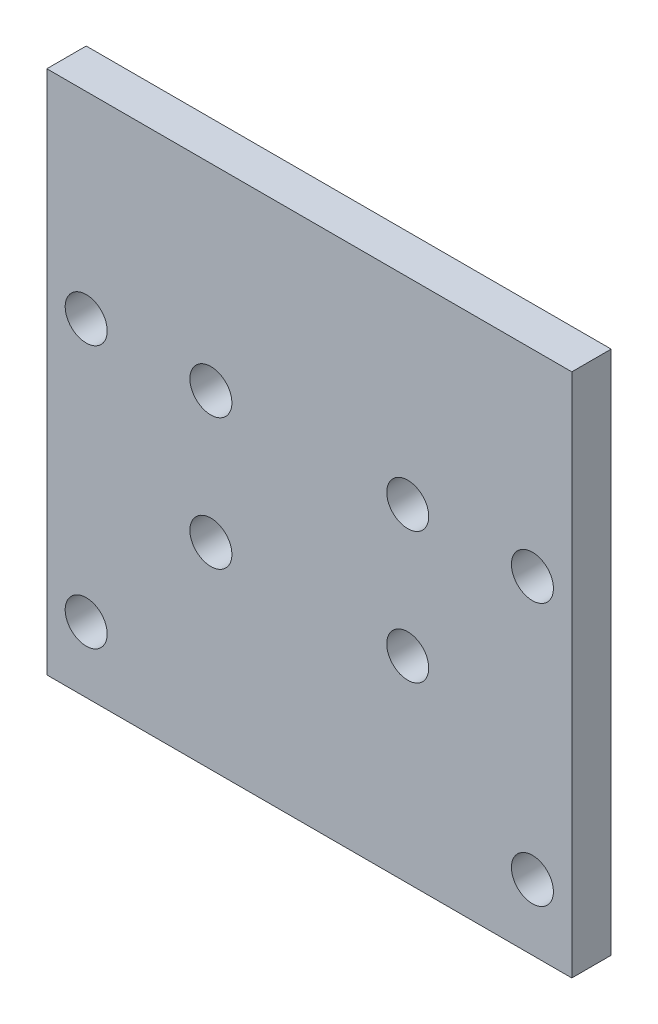
ISO-10303-21;
HEADER;
FILE_DESCRIPTION(('STEP AP214'),'2;1');
FILE_NAME('part.step','',(''),(''),'','','');
FILE_SCHEMA(('AUTOMOTIVE_DESIGN { 1 0 10303 214 1 1 1 1 }'));
ENDSEC;
DATA;
#1=APPLICATION_CONTEXT('core data for automotive mechanical design processes');
#2=APPLICATION_PROTOCOL_DEFINITION('international standard','automotive_design',2000,#1);
#3=PRODUCT_CONTEXT('',#1,'mechanical');
#4=PRODUCT('Part','Part','',(#3));
#5=PRODUCT_RELATED_PRODUCT_CATEGORY('part','',(#4));
#6=PRODUCT_DEFINITION_FORMATION('','',#4);
#7=PRODUCT_DEFINITION_CONTEXT('part definition',#1,'design');
#8=PRODUCT_DEFINITION('design','',#6,#7);
#9=PRODUCT_DEFINITION_SHAPE('','',#8);
#10=(LENGTH_UNIT() NAMED_UNIT(*) SI_UNIT(.MILLI.,.METRE.));
#11=(NAMED_UNIT(*) PLANE_ANGLE_UNIT() SI_UNIT($,.RADIAN.));
#12=(NAMED_UNIT(*) SI_UNIT($,.STERADIAN.) SOLID_ANGLE_UNIT());
#13=UNCERTAINTY_MEASURE_WITH_UNIT(LENGTH_MEASURE(1.E-05),#10,'distance_accuracy_value','');
#14=(GEOMETRIC_REPRESENTATION_CONTEXT(3) GLOBAL_UNCERTAINTY_ASSIGNED_CONTEXT((#13)) GLOBAL_UNIT_ASSIGNED_CONTEXT((#10,
#11,#12)) REPRESENTATION_CONTEXT('',''));
#15=CARTESIAN_POINT('',(0.,0.,0.));
#16=DIRECTION('',(0.,0.,1.));
#17=DIRECTION('',(1.,0.,0.));
#18=AXIS2_PLACEMENT_3D('',#15,#16,#17);
#19=CARTESIAN_POINT('',(20.,-20.,3.));
#20=DIRECTION('',(-1.,0.,0.));
#21=DIRECTION('',(0.,0.,1.));
#22=AXIS2_PLACEMENT_3D('',#19,#20,#21);
#23=PLANE('',#22);
#24=DIRECTION('',(0.,1.,0.));
#25=VECTOR('',#24,1.);
#26=CARTESIAN_POINT('',(20.,-20.,0.));
#27=LINE('',#26,#25);
#28=CARTESIAN_POINT('',(20.,-20.,0.));
#29=VERTEX_POINT('',#28);
#30=CARTESIAN_POINT('',(20.,20.,0.));
#31=VERTEX_POINT('',#30);
#32=EDGE_CURVE('E102',#29,#31,#27,.T.);
#33=ORIENTED_EDGE('',*,*,#32,.T.);
#34=DIRECTION('',(0.,0.,-1.));
#35=VECTOR('',#34,1.);
#36=CARTESIAN_POINT('',(20.,20.,3.));
#37=LINE('',#36,#35);
#38=CARTESIAN_POINT('',(20.,20.,3.));
#39=VERTEX_POINT('',#38);
#40=EDGE_CURVE('E11',#39,#31,#37,.T.);
#41=ORIENTED_EDGE('',*,*,#40,.F.);
#42=DIRECTION('',(0.,1.,0.));
#43=VECTOR('',#42,1.);
#44=CARTESIAN_POINT('',(20.,-20.,3.));
#45=LINE('',#44,#43);
#46=CARTESIAN_POINT('',(20.,-20.,3.));
#47=VERTEX_POINT('',#46);
#48=EDGE_CURVE('E90',#47,#39,#45,.T.);
#49=ORIENTED_EDGE('',*,*,#48,.F.);
#50=DIRECTION('',(0.,0.,-1.));
#51=VECTOR('',#50,1.);
#52=CARTESIAN_POINT('',(20.,-20.,3.));
#53=LINE('',#52,#51);
#54=EDGE_CURVE('E98',#47,#29,#53,.T.);
#55=ORIENTED_EDGE('',*,*,#54,.T.);
#56=EDGE_LOOP('',(#33,#41,#49,#55));
#57=FACE_BOUND('',#56,.T.);
#58=ADVANCED_FACE('F39',(#57),#23,.F.);
#59=CARTESIAN_POINT('',(-20.,20.,3.));
#60=DIRECTION('',(0.,-1.,0.));
#61=DIRECTION('',(0.,0.,-1.));
#62=AXIS2_PLACEMENT_3D('',#59,#60,#61);
#63=PLANE('',#62);
#64=DIRECTION('',(-1.,0.,0.));
#65=VECTOR('',#64,1.);
#66=CARTESIAN_POINT('',(-20.,20.,0.));
#67=LINE('',#66,#65);
#68=CARTESIAN_POINT('',(-20.,20.,0.));
#69=VERTEX_POINT('',#68);
#70=EDGE_CURVE('E94',#31,#69,#67,.T.);
#71=ORIENTED_EDGE('',*,*,#70,.T.);
#72=DIRECTION('',(0.,0.,-1.));
#73=VECTOR('',#72,1.);
#74=CARTESIAN_POINT('',(-20.,20.,3.));
#75=LINE('',#74,#73);
#76=CARTESIAN_POINT('',(-20.,20.,3.));
#77=VERTEX_POINT('',#76);
#78=EDGE_CURVE('E47',#77,#69,#75,.T.);
#79=ORIENTED_EDGE('',*,*,#78,.F.);
#80=DIRECTION('',(-1.,0.,0.));
#81=VECTOR('',#80,1.);
#82=CARTESIAN_POINT('',(-20.,20.,3.));
#83=LINE('',#82,#81);
#84=EDGE_CURVE('E85',#39,#77,#83,.T.);
#85=ORIENTED_EDGE('',*,*,#84,.F.);
#86=ORIENTED_EDGE('',*,*,#40,.T.);
#87=EDGE_LOOP('',(#71,#79,#85,#86));
#88=FACE_BOUND('',#87,.T.);
#89=ADVANCED_FACE('F93',(#88),#63,.F.);
#90=CARTESIAN_POINT('',(-20.,-20.,3.));
#91=DIRECTION('',(1.,0.,0.));
#92=DIRECTION('',(0.,0.,-1.));
#93=AXIS2_PLACEMENT_3D('',#90,#91,#92);
#94=PLANE('',#93);
#95=DIRECTION('',(0.,-1.,0.));
#96=VECTOR('',#95,1.);
#97=CARTESIAN_POINT('',(-20.,-20.,0.));
#98=LINE('',#97,#96);
#99=CARTESIAN_POINT('',(-20.,-20.,0.));
#100=VERTEX_POINT('',#99);
#101=EDGE_CURVE('E72',#69,#100,#98,.T.);
#102=ORIENTED_EDGE('',*,*,#101,.T.);
#103=DIRECTION('',(0.,0.,-1.));
#104=VECTOR('',#103,1.);
#105=CARTESIAN_POINT('',(-20.,-20.,3.));
#106=LINE('',#105,#104);
#107=CARTESIAN_POINT('',(-20.,-20.,3.));
#108=VERTEX_POINT('',#107);
#109=EDGE_CURVE('E95',#108,#100,#106,.T.);
#110=ORIENTED_EDGE('',*,*,#109,.F.);
#111=DIRECTION('',(0.,-1.,0.));
#112=VECTOR('',#111,1.);
#113=CARTESIAN_POINT('',(-20.,-20.,3.));
#114=LINE('',#113,#112);
#115=EDGE_CURVE('E88',#77,#108,#114,.T.);
#116=ORIENTED_EDGE('',*,*,#115,.F.);
#117=ORIENTED_EDGE('',*,*,#78,.T.);
#118=EDGE_LOOP('',(#102,#110,#116,#117));
#119=FACE_BOUND('',#118,.T.);
#120=ADVANCED_FACE('F96',(#119),#94,.F.);
#121=CARTESIAN_POINT('',(-20.,-20.,3.));
#122=DIRECTION('',(0.,1.,0.));
#123=DIRECTION('',(0.,0.,1.));
#124=AXIS2_PLACEMENT_3D('',#121,#122,#123);
#125=PLANE('',#124);
#126=DIRECTION('',(1.,0.,0.));
#127=VECTOR('',#126,1.);
#128=CARTESIAN_POINT('',(-20.,-20.,0.));
#129=LINE('',#128,#127);
#130=EDGE_CURVE('E78',#100,#29,#129,.T.);
#131=ORIENTED_EDGE('',*,*,#130,.T.);
#132=ORIENTED_EDGE('',*,*,#54,.F.);
#133=DIRECTION('',(1.,0.,0.));
#134=VECTOR('',#133,1.);
#135=CARTESIAN_POINT('',(-20.,-20.,3.));
#136=LINE('',#135,#134);
#137=EDGE_CURVE('E55',#108,#47,#136,.T.);
#138=ORIENTED_EDGE('',*,*,#137,.F.);
#139=ORIENTED_EDGE('',*,*,#109,.T.);
#140=EDGE_LOOP('',(#131,#132,#138,#139));
#141=FACE_BOUND('',#140,.T.);
#142=ADVANCED_FACE('F110',(#141),#125,.F.);
#143=CARTESIAN_POINT('',(0.,0.,3.));
#144=DIRECTION('',(0.,0.,-1.));
#145=DIRECTION('',(-1.,0.,0.));
#146=AXIS2_PLACEMENT_3D('',#143,#144,#145);
#147=PLANE('',#146);
#148=CARTESIAN_POINT('',(7.5,5.,3.));
#149=DIRECTION('',(0.,0.,1.));
#150=DIRECTION('',(1.,0.,0.));
#151=AXIS2_PLACEMENT_3D('',#148,#149,#150);
#152=CIRCLE('',#151,1.6);
#153=CARTESIAN_POINT('',(9.1,5.,3.));
#154=VERTEX_POINT('',#153);
#155=EDGE_CURVE('E141',#154,#154,#152,.T.);
#156=ORIENTED_EDGE('',*,*,#155,.F.);
#157=EDGE_LOOP('',(#156));
#158=FACE_BOUND('',#157,.T.);
#159=CARTESIAN_POINT('',(7.5,-5.,3.));
#160=DIRECTION('',(0.,0.,1.));
#161=DIRECTION('',(1.,0.,0.));
#162=AXIS2_PLACEMENT_3D('',#159,#160,#161);
#163=CIRCLE('',#162,1.6);
#164=CARTESIAN_POINT('',(9.1,-5.,3.));
#165=VERTEX_POINT('',#164);
#166=EDGE_CURVE('E135',#165,#165,#163,.T.);
#167=ORIENTED_EDGE('',*,*,#166,.F.);
#168=EDGE_LOOP('',(#167));
#169=FACE_BOUND('',#168,.T.);
#170=CARTESIAN_POINT('',(-7.5,-5.,3.));
#171=DIRECTION('',(0.,0.,1.));
#172=DIRECTION('',(1.,0.,0.));
#173=AXIS2_PLACEMENT_3D('',#170,#171,#172);
#174=CIRCLE('',#173,1.6);
#175=CARTESIAN_POINT('',(-5.9,-5.,3.));
#176=VERTEX_POINT('',#175);
#177=EDGE_CURVE('E129',#176,#176,#174,.T.);
#178=ORIENTED_EDGE('',*,*,#177,.F.);
#179=EDGE_LOOP('',(#178));
#180=FACE_BOUND('',#179,.T.);
#181=CARTESIAN_POINT('',(-17.,-15.,3.));
#182=DIRECTION('',(0.,0.,1.));
#183=DIRECTION('',(1.,0.,0.));
#184=AXIS2_PLACEMENT_3D('',#181,#182,#183);
#185=CIRCLE('',#184,1.6);
#186=CARTESIAN_POINT('',(-15.4,-15.,3.));
#187=VERTEX_POINT('',#186);
#188=EDGE_CURVE('E122',#187,#187,#185,.T.);
#189=ORIENTED_EDGE('',*,*,#188,.F.);
#190=EDGE_LOOP('',(#189));
#191=FACE_BOUND('',#190,.T.);
#192=CARTESIAN_POINT('',(-17.,5.,3.));
#193=DIRECTION('',(0.,0.,1.));
#194=DIRECTION('',(1.,0.,0.));
#195=AXIS2_PLACEMENT_3D('',#192,#193,#194);
#196=CIRCLE('',#195,1.6);
#197=CARTESIAN_POINT('',(-15.4,5.,3.));
#198=VERTEX_POINT('',#197);
#199=EDGE_CURVE('E158',#198,#198,#196,.T.);
#200=ORIENTED_EDGE('',*,*,#199,.F.);
#201=EDGE_LOOP('',(#200));
#202=FACE_BOUND('',#201,.T.);
#203=CARTESIAN_POINT('',(17.,5.,3.));
#204=DIRECTION('',(0.,0.,1.));
#205=DIRECTION('',(-1.,0.,0.));
#206=AXIS2_PLACEMENT_3D('',#203,#204,#205);
#207=CIRCLE('',#206,1.6);
#208=CARTESIAN_POINT('',(15.4,5.,3.));
#209=VERTEX_POINT('',#208);
#210=EDGE_CURVE('E152',#209,#209,#207,.T.);
#211=ORIENTED_EDGE('',*,*,#210,.F.);
#212=EDGE_LOOP('',(#211));
#213=FACE_BOUND('',#212,.T.);
#214=CARTESIAN_POINT('',(17.,-15.,3.));
#215=DIRECTION('',(0.,0.,1.));
#216=DIRECTION('',(-1.,0.,0.));
#217=AXIS2_PLACEMENT_3D('',#214,#215,#216);
#218=CIRCLE('',#217,1.6);
#219=CARTESIAN_POINT('',(15.4,-15.,3.));
#220=VERTEX_POINT('',#219);
#221=EDGE_CURVE('E146',#220,#220,#218,.T.);
#222=ORIENTED_EDGE('',*,*,#221,.F.);
#223=EDGE_LOOP('',(#222));
#224=FACE_BOUND('',#223,.T.);
#225=CARTESIAN_POINT('',(-7.5,5.,3.));
#226=DIRECTION('',(0.,0.,1.));
#227=DIRECTION('',(1.,0.,0.));
#228=AXIS2_PLACEMENT_3D('',#225,#226,#227);
#229=CIRCLE('',#228,1.6);
#230=CARTESIAN_POINT('',(-5.9,5.,3.));
#231=VERTEX_POINT('',#230);
#232=EDGE_CURVE('E116',#231,#231,#229,.T.);
#233=ORIENTED_EDGE('',*,*,#232,.F.);
#234=EDGE_LOOP('',(#233));
#235=FACE_BOUND('',#234,.T.);
#236=ORIENTED_EDGE('',*,*,#48,.T.);
#237=ORIENTED_EDGE('',*,*,#84,.T.);
#238=ORIENTED_EDGE('',*,*,#115,.T.);
#239=ORIENTED_EDGE('',*,*,#137,.T.);
#240=EDGE_LOOP('',(#236,#237,#238,#239));
#241=FACE_BOUND('',#240,.T.);
#242=ADVANCED_FACE('F86',(#158,#169,#180,#191,#202,#213,#224,#235,#241),#147,.F.);
#243=CARTESIAN_POINT('',(0.,0.,0.));
#244=DIRECTION('',(0.,0.,-1.));
#245=DIRECTION('',(-1.,0.,0.));
#246=AXIS2_PLACEMENT_3D('',#243,#244,#245);
#247=PLANE('',#246);
#248=CARTESIAN_POINT('',(7.5,5.,0.));
#249=DIRECTION('',(0.,0.,1.));
#250=DIRECTION('',(1.,0.,0.));
#251=AXIS2_PLACEMENT_3D('',#248,#249,#250);
#252=CIRCLE('',#251,1.6);
#253=CARTESIAN_POINT('',(9.1,5.,0.));
#254=VERTEX_POINT('',#253);
#255=EDGE_CURVE('E119',#254,#254,#252,.T.);
#256=ORIENTED_EDGE('',*,*,#255,.T.);
#257=EDGE_LOOP('',(#256));
#258=FACE_BOUND('',#257,.T.);
#259=CARTESIAN_POINT('',(7.5,-5.,0.));
#260=DIRECTION('',(0.,0.,1.));
#261=DIRECTION('',(1.,0.,0.));
#262=AXIS2_PLACEMENT_3D('',#259,#260,#261);
#263=CIRCLE('',#262,1.6);
#264=CARTESIAN_POINT('',(9.1,-5.,0.));
#265=VERTEX_POINT('',#264);
#266=EDGE_CURVE('E138',#265,#265,#263,.T.);
#267=ORIENTED_EDGE('',*,*,#266,.T.);
#268=EDGE_LOOP('',(#267));
#269=FACE_BOUND('',#268,.T.);
#270=CARTESIAN_POINT('',(-7.5,-5.,0.));
#271=DIRECTION('',(0.,0.,1.));
#272=DIRECTION('',(1.,0.,0.));
#273=AXIS2_PLACEMENT_3D('',#270,#271,#272);
#274=CIRCLE('',#273,1.6);
#275=CARTESIAN_POINT('',(-5.9,-5.,0.));
#276=VERTEX_POINT('',#275);
#277=EDGE_CURVE('E132',#276,#276,#274,.T.);
#278=ORIENTED_EDGE('',*,*,#277,.T.);
#279=EDGE_LOOP('',(#278));
#280=FACE_BOUND('',#279,.T.);
#281=CARTESIAN_POINT('',(-17.,-15.,0.));
#282=DIRECTION('',(0.,0.,1.));
#283=DIRECTION('',(1.,0.,0.));
#284=AXIS2_PLACEMENT_3D('',#281,#282,#283);
#285=CIRCLE('',#284,1.6);
#286=CARTESIAN_POINT('',(-15.4,-15.,0.));
#287=VERTEX_POINT('',#286);
#288=EDGE_CURVE('E125',#287,#287,#285,.T.);
#289=ORIENTED_EDGE('',*,*,#288,.T.);
#290=EDGE_LOOP('',(#289));
#291=FACE_BOUND('',#290,.T.);
#292=CARTESIAN_POINT('',(-17.,5.,0.));
#293=DIRECTION('',(0.,0.,1.));
#294=DIRECTION('',(1.,0.,0.));
#295=AXIS2_PLACEMENT_3D('',#292,#293,#294);
#296=CIRCLE('',#295,1.6);
#297=CARTESIAN_POINT('',(-15.4,5.,0.));
#298=VERTEX_POINT('',#297);
#299=EDGE_CURVE('E126',#298,#298,#296,.T.);
#300=ORIENTED_EDGE('',*,*,#299,.T.);
#301=EDGE_LOOP('',(#300));
#302=FACE_BOUND('',#301,.T.);
#303=CARTESIAN_POINT('',(17.,5.,0.));
#304=DIRECTION('',(0.,0.,1.));
#305=DIRECTION('',(-1.,0.,0.));
#306=AXIS2_PLACEMENT_3D('',#303,#304,#305);
#307=CIRCLE('',#306,1.6);
#308=CARTESIAN_POINT('',(15.4,5.,0.));
#309=VERTEX_POINT('',#308);
#310=EDGE_CURVE('E155',#309,#309,#307,.T.);
#311=ORIENTED_EDGE('',*,*,#310,.T.);
#312=EDGE_LOOP('',(#311));
#313=FACE_BOUND('',#312,.T.);
#314=CARTESIAN_POINT('',(17.,-15.,0.));
#315=DIRECTION('',(0.,0.,1.));
#316=DIRECTION('',(-1.,0.,0.));
#317=AXIS2_PLACEMENT_3D('',#314,#315,#316);
#318=CIRCLE('',#317,1.6);
#319=CARTESIAN_POINT('',(15.4,-15.,0.));
#320=VERTEX_POINT('',#319);
#321=EDGE_CURVE('E149',#320,#320,#318,.T.);
#322=ORIENTED_EDGE('',*,*,#321,.T.);
#323=EDGE_LOOP('',(#322));
#324=FACE_BOUND('',#323,.T.);
#325=CARTESIAN_POINT('',(-7.5,5.,0.));
#326=DIRECTION('',(0.,0.,1.));
#327=DIRECTION('',(1.,0.,0.));
#328=AXIS2_PLACEMENT_3D('',#325,#326,#327);
#329=CIRCLE('',#328,1.6);
#330=CARTESIAN_POINT('',(-5.9,5.,0.));
#331=VERTEX_POINT('',#330);
#332=EDGE_CURVE('E105',#331,#331,#329,.T.);
#333=ORIENTED_EDGE('',*,*,#332,.T.);
#334=EDGE_LOOP('',(#333));
#335=FACE_BOUND('',#334,.T.);
#336=ORIENTED_EDGE('',*,*,#32,.F.);
#337=ORIENTED_EDGE('',*,*,#130,.F.);
#338=ORIENTED_EDGE('',*,*,#101,.F.);
#339=ORIENTED_EDGE('',*,*,#70,.F.);
#340=EDGE_LOOP('',(#336,#337,#338,#339));
#341=FACE_BOUND('',#340,.T.);
#342=ADVANCED_FACE('F113',(#258,#269,#280,#291,#302,#313,#324,#335,#341),#247,.T.);
#343=CARTESIAN_POINT('',(-7.5,5.,0.));
#344=DIRECTION('',(0.,0.,1.));
#345=DIRECTION('',(1.,0.,0.));
#346=AXIS2_PLACEMENT_3D('',#343,#344,#345);
#347=CYLINDRICAL_SURFACE('',#346,1.6);
#348=ORIENTED_EDGE('',*,*,#332,.F.);
#349=EDGE_LOOP('',(#348));
#350=FACE_BOUND('',#349,.T.);
#351=ORIENTED_EDGE('',*,*,#232,.T.);
#352=EDGE_LOOP('',(#351));
#353=FACE_BOUND('',#352,.T.);
#354=ADVANCED_FACE('F184',(#350,#353),#347,.F.);
#355=CARTESIAN_POINT('',(17.,-15.,0.));
#356=DIRECTION('',(0.,0.,1.));
#357=DIRECTION('',(1.,0.,0.));
#358=AXIS2_PLACEMENT_3D('',#355,#356,#357);
#359=CYLINDRICAL_SURFACE('',#358,1.6);
#360=ORIENTED_EDGE('',*,*,#321,.F.);
#361=EDGE_LOOP('',(#360));
#362=FACE_BOUND('',#361,.T.);
#363=ORIENTED_EDGE('',*,*,#221,.T.);
#364=EDGE_LOOP('',(#363));
#365=FACE_BOUND('',#364,.T.);
#366=ADVANCED_FACE('F186',(#362,#365),#359,.F.);
#367=CARTESIAN_POINT('',(17.,5.,0.));
#368=DIRECTION('',(0.,0.,1.));
#369=DIRECTION('',(1.,0.,0.));
#370=AXIS2_PLACEMENT_3D('',#367,#368,#369);
#371=CYLINDRICAL_SURFACE('',#370,1.6);
#372=ORIENTED_EDGE('',*,*,#310,.F.);
#373=EDGE_LOOP('',(#372));
#374=FACE_BOUND('',#373,.T.);
#375=ORIENTED_EDGE('',*,*,#210,.T.);
#376=EDGE_LOOP('',(#375));
#377=FACE_BOUND('',#376,.T.);
#378=ADVANCED_FACE('F170',(#374,#377),#371,.F.);
#379=CARTESIAN_POINT('',(-17.,5.,0.));
#380=DIRECTION('',(0.,0.,1.));
#381=DIRECTION('',(1.,0.,0.));
#382=AXIS2_PLACEMENT_3D('',#379,#380,#381);
#383=CYLINDRICAL_SURFACE('',#382,1.6);
#384=ORIENTED_EDGE('',*,*,#299,.F.);
#385=EDGE_LOOP('',(#384));
#386=FACE_BOUND('',#385,.T.);
#387=ORIENTED_EDGE('',*,*,#199,.T.);
#388=EDGE_LOOP('',(#387));
#389=FACE_BOUND('',#388,.T.);
#390=ADVANCED_FACE('F166',(#386,#389),#383,.F.);
#391=CARTESIAN_POINT('',(-17.,-15.,0.));
#392=DIRECTION('',(0.,0.,1.));
#393=DIRECTION('',(1.,0.,0.));
#394=AXIS2_PLACEMENT_3D('',#391,#392,#393);
#395=CYLINDRICAL_SURFACE('',#394,1.6);
#396=ORIENTED_EDGE('',*,*,#288,.F.);
#397=EDGE_LOOP('',(#396));
#398=FACE_BOUND('',#397,.T.);
#399=ORIENTED_EDGE('',*,*,#188,.T.);
#400=EDGE_LOOP('',(#399));
#401=FACE_BOUND('',#400,.T.);
#402=ADVANCED_FACE('F169',(#398,#401),#395,.F.);
#403=CARTESIAN_POINT('',(-7.5,-5.,0.));
#404=DIRECTION('',(0.,0.,1.));
#405=DIRECTION('',(1.,0.,0.));
#406=AXIS2_PLACEMENT_3D('',#403,#404,#405);
#407=CYLINDRICAL_SURFACE('',#406,1.6);
#408=ORIENTED_EDGE('',*,*,#277,.F.);
#409=EDGE_LOOP('',(#408));
#410=FACE_BOUND('',#409,.T.);
#411=ORIENTED_EDGE('',*,*,#177,.T.);
#412=EDGE_LOOP('',(#411));
#413=FACE_BOUND('',#412,.T.);
#414=ADVANCED_FACE('F245',(#410,#413),#407,.F.);
#415=CARTESIAN_POINT('',(7.5,-5.,0.));
#416=DIRECTION('',(0.,0.,1.));
#417=DIRECTION('',(1.,0.,0.));
#418=AXIS2_PLACEMENT_3D('',#415,#416,#417);
#419=CYLINDRICAL_SURFACE('',#418,1.6);
#420=ORIENTED_EDGE('',*,*,#266,.F.);
#421=EDGE_LOOP('',(#420));
#422=FACE_BOUND('',#421,.T.);
#423=ORIENTED_EDGE('',*,*,#166,.T.);
#424=EDGE_LOOP('',(#423));
#425=FACE_BOUND('',#424,.T.);
#426=ADVANCED_FACE('F252',(#422,#425),#419,.F.);
#427=CARTESIAN_POINT('',(7.5,5.,0.));
#428=DIRECTION('',(0.,0.,1.));
#429=DIRECTION('',(1.,0.,0.));
#430=AXIS2_PLACEMENT_3D('',#427,#428,#429);
#431=CYLINDRICAL_SURFACE('',#430,1.6);
#432=ORIENTED_EDGE('',*,*,#255,.F.);
#433=EDGE_LOOP('',(#432));
#434=FACE_BOUND('',#433,.T.);
#435=ORIENTED_EDGE('',*,*,#155,.T.);
#436=EDGE_LOOP('',(#435));
#437=FACE_BOUND('',#436,.T.);
#438=ADVANCED_FACE('F260',(#434,#437),#431,.F.);
#439=CLOSED_SHELL('',(#58,#89,#120,#142,#242,#342,#354,#366,#378,#390,#402,#414,#426,#438));
#440=MANIFOLD_SOLID_BREP('B2',#439);
#441=ADVANCED_BREP_SHAPE_REPRESENTATION('',(#18,#440),#14);
#442=SHAPE_DEFINITION_REPRESENTATION(#9,#441);
ENDSEC;
END-ISO-10303-21;
